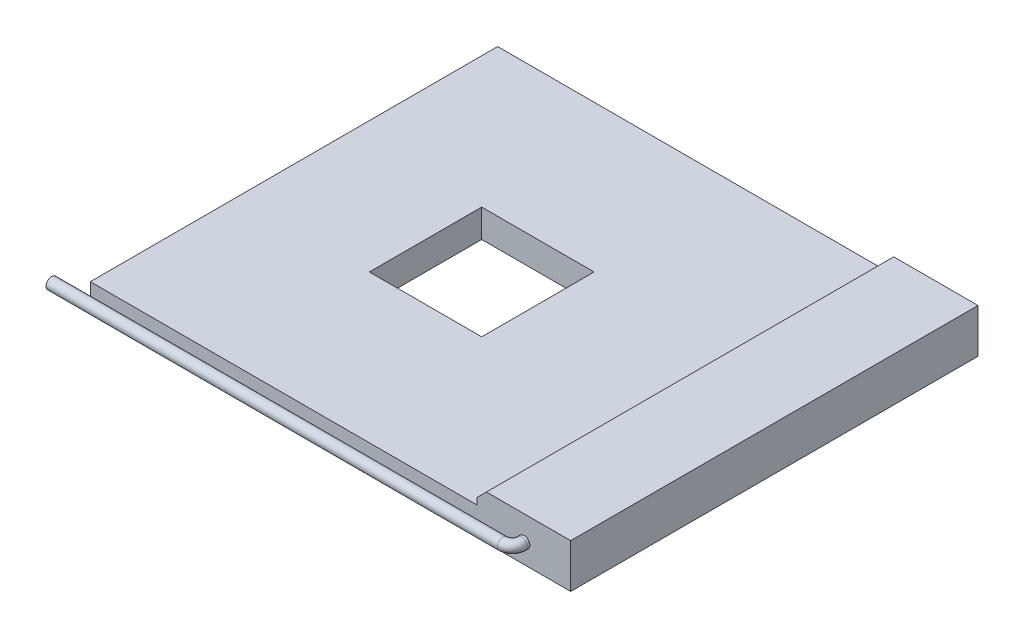
ISO-10303-21;
HEADER;
FILE_DESCRIPTION(('STEP AP214'),'2;1');
FILE_NAME('part.step','',(''),(''),'','','');
FILE_SCHEMA(('AUTOMOTIVE_DESIGN { 1 0 10303 214 1 1 1 1 }'));
ENDSEC;
DATA;
#1=APPLICATION_CONTEXT('core data for automotive mechanical design processes');
#2=APPLICATION_PROTOCOL_DEFINITION('international standard','automotive_design',2000,#1);
#3=PRODUCT_CONTEXT('',#1,'mechanical');
#4=PRODUCT('Part','Part','',(#3));
#5=PRODUCT_RELATED_PRODUCT_CATEGORY('part','',(#4));
#6=PRODUCT_DEFINITION_FORMATION('','',#4);
#7=PRODUCT_DEFINITION_CONTEXT('part definition',#1,'design');
#8=PRODUCT_DEFINITION('design','',#6,#7);
#9=PRODUCT_DEFINITION_SHAPE('','',#8);
#10=(LENGTH_UNIT() NAMED_UNIT(*) SI_UNIT(.MILLI.,.METRE.));
#11=(NAMED_UNIT(*) PLANE_ANGLE_UNIT() SI_UNIT($,.RADIAN.));
#12=(NAMED_UNIT(*) SI_UNIT($,.STERADIAN.) SOLID_ANGLE_UNIT());
#13=UNCERTAINTY_MEASURE_WITH_UNIT(LENGTH_MEASURE(1.E-05),#10,'distance_accuracy_value','');
#14=(GEOMETRIC_REPRESENTATION_CONTEXT(3) GLOBAL_UNCERTAINTY_ASSIGNED_CONTEXT((#13)) GLOBAL_UNIT_ASSIGNED_CONTEXT((#10,
#11,#12)) REPRESENTATION_CONTEXT('',''));
#15=CARTESIAN_POINT('',(0.,0.,0.));
#16=DIRECTION('',(0.,0.,1.));
#17=DIRECTION('',(1.,0.,0.));
#18=AXIS2_PLACEMENT_3D('',#15,#16,#17);
#19=CARTESIAN_POINT('',(0.,3.,0.));
#20=DIRECTION('',(0.,-1.,0.));
#21=DIRECTION('',(0.,0.,-1.));
#22=AXIS2_PLACEMENT_3D('',#19,#20,#21);
#23=PLANE('',#22);
#24=DIRECTION('',(1.,0.,0.));
#25=VECTOR('',#24,1.);
#26=CARTESIAN_POINT('',(-11.65,3.,5.95));
#27=LINE('',#26,#25);
#28=CARTESIAN_POINT('',(-11.65,3.,5.95));
#29=VERTEX_POINT('',#28);
#30=CARTESIAN_POINT('',(0.350000000000008,3.,5.95));
#31=VERTEX_POINT('',#30);
#32=EDGE_CURVE('E178',#29,#31,#27,.T.);
#33=ORIENTED_EDGE('',*,*,#32,.F.);
#34=DIRECTION('',(0.,0.,1.));
#35=VECTOR('',#34,1.);
#36=CARTESIAN_POINT('',(-11.65,3.,-6.05));
#37=LINE('',#36,#35);
#38=CARTESIAN_POINT('',(-11.65,3.,-6.05));
#39=VERTEX_POINT('',#38);
#40=EDGE_CURVE('E162',#39,#29,#37,.T.);
#41=ORIENTED_EDGE('',*,*,#40,.F.);
#42=DIRECTION('',(-1.,0.,0.));
#43=VECTOR('',#42,1.);
#44=CARTESIAN_POINT('',(-11.65,3.,-6.05));
#45=LINE('',#44,#43);
#46=CARTESIAN_POINT('',(0.350000000000007,3.,-6.05));
#47=VERTEX_POINT('',#46);
#48=EDGE_CURVE('E167',#47,#39,#45,.T.);
#49=ORIENTED_EDGE('',*,*,#48,.F.);
#50=DIRECTION('',(0.,0.,-1.));
#51=VECTOR('',#50,1.);
#52=CARTESIAN_POINT('',(0.350000000000007,3.,-6.05));
#53=LINE('',#52,#51);
#54=EDGE_CURVE('E181',#31,#47,#53,.T.);
#55=ORIENTED_EDGE('',*,*,#54,.F.);
#56=EDGE_LOOP('',(#33,#41,#49,#55));
#57=FACE_BOUND('',#56,.T.);
#58=DIRECTION('',(0.,0.,1.));
#59=VECTOR('',#58,1.);
#60=CARTESIAN_POINT('',(15.65,3.,-21.75));
#61=LINE('',#60,#59);
#62=CARTESIAN_POINT('',(15.65,3.,-21.75));
#63=VERTEX_POINT('',#62);
#64=CARTESIAN_POINT('',(15.65,3.,21.75));
#65=VERTEX_POINT('',#64);
#66=EDGE_CURVE('E149',#63,#65,#61,.T.);
#67=ORIENTED_EDGE('',*,*,#66,.F.);
#68=DIRECTION('',(-1.,0.,0.));
#69=VECTOR('',#68,1.);
#70=CARTESIAN_POINT('',(-25.65,3.,-21.75));
#71=LINE('',#70,#69);
#72=CARTESIAN_POINT('',(-25.65,3.,-21.75));
#73=VERTEX_POINT('',#72);
#74=EDGE_CURVE('E194',#63,#73,#71,.T.);
#75=ORIENTED_EDGE('',*,*,#74,.T.);
#76=DIRECTION('',(0.,0.,1.));
#77=VECTOR('',#76,1.);
#78=CARTESIAN_POINT('',(-25.65,3.,21.75));
#79=LINE('',#78,#77);
#80=CARTESIAN_POINT('',(-25.65,3.,21.75));
#81=VERTEX_POINT('',#80);
#82=EDGE_CURVE('E196',#73,#81,#79,.T.);
#83=ORIENTED_EDGE('',*,*,#82,.T.);
#84=DIRECTION('',(1.,0.,0.));
#85=VECTOR('',#84,1.);
#86=CARTESIAN_POINT('',(-25.65,3.,21.75));
#87=LINE('',#86,#85);
#88=EDGE_CURVE('E199',#81,#65,#87,.T.);
#89=ORIENTED_EDGE('',*,*,#88,.T.);
#90=EDGE_LOOP('',(#67,#75,#83,#89));
#91=FACE_BOUND('',#90,.T.);
#92=ADVANCED_FACE('F40',(#57,#91),#23,.F.);
#93=CARTESIAN_POINT('',(25.65,3.,21.75));
#94=DIRECTION('',(-1.,0.,0.));
#95=DIRECTION('',(0.,0.,1.));
#96=AXIS2_PLACEMENT_3D('',#93,#94,#95);
#97=PLANE('',#96);
#98=DIRECTION('',(0.,0.,-1.));
#99=VECTOR('',#98,1.);
#100=CARTESIAN_POINT('',(25.65,0.,21.75));
#101=LINE('',#100,#99);
#102=CARTESIAN_POINT('',(25.65,0.,21.75));
#103=VERTEX_POINT('',#102);
#104=CARTESIAN_POINT('',(25.65,0.,-21.75));
#105=VERTEX_POINT('',#104);
#106=EDGE_CURVE('E133',#103,#105,#101,.T.);
#107=ORIENTED_EDGE('',*,*,#106,.T.);
#108=DIRECTION('',(0.,-1.,0.));
#109=VECTOR('',#108,1.);
#110=CARTESIAN_POINT('',(25.65,3.,-21.75));
#111=LINE('',#110,#109);
#112=CARTESIAN_POINT('',(25.65,4.7,-21.75));
#113=VERTEX_POINT('',#112);
#114=EDGE_CURVE('E126',#113,#105,#111,.T.);
#115=ORIENTED_EDGE('',*,*,#114,.F.);
#116=DIRECTION('',(0.,0.,-1.));
#117=VECTOR('',#116,1.);
#118=CARTESIAN_POINT('',(25.65,4.7,-21.75));
#119=LINE('',#118,#117);
#120=CARTESIAN_POINT('',(25.65,4.7,21.75));
#121=VERTEX_POINT('',#120);
#122=EDGE_CURVE('E131',#121,#113,#119,.T.);
#123=ORIENTED_EDGE('',*,*,#122,.F.);
#124=DIRECTION('',(0.,-1.,0.));
#125=VECTOR('',#124,1.);
#126=CARTESIAN_POINT('',(25.65,3.,21.75));
#127=LINE('',#126,#125);
#128=EDGE_CURVE('E203',#121,#103,#127,.T.);
#129=ORIENTED_EDGE('',*,*,#128,.T.);
#130=EDGE_LOOP('',(#107,#115,#123,#129));
#131=FACE_BOUND('',#130,.T.);
#132=ADVANCED_FACE('F128',(#131),#97,.F.);
#133=CARTESIAN_POINT('',(-25.65,3.,-21.75));
#134=DIRECTION('',(0.,0.,1.));
#135=DIRECTION('',(1.,0.,0.));
#136=AXIS2_PLACEMENT_3D('',#133,#134,#135);
#137=PLANE('',#136);
#138=DIRECTION('',(0.,-1.,0.));
#139=VECTOR('',#138,1.);
#140=CARTESIAN_POINT('',(15.65,4.7,-21.75));
#141=LINE('',#140,#139);
#142=CARTESIAN_POINT('',(15.65,3.7,-21.75));
#143=VERTEX_POINT('',#142);
#144=EDGE_CURVE('E160',#143,#63,#141,.T.);
#145=ORIENTED_EDGE('',*,*,#144,.F.);
#146=DIRECTION('',(-0.707106781186548,-0.707106781186547,0.));
#147=VECTOR('',#146,1.);
#148=CARTESIAN_POINT('',(16.65,4.7,-21.75));
#149=LINE('',#148,#147);
#150=CARTESIAN_POINT('',(16.65,4.7,-21.75));
#151=VERTEX_POINT('',#150);
#152=EDGE_CURVE('E45',#143,#151,#149,.F.);
#153=ORIENTED_EDGE('',*,*,#152,.T.);
#154=DIRECTION('',(-1.,0.,0.));
#155=VECTOR('',#154,1.);
#156=CARTESIAN_POINT('',(25.65,4.7,-21.75));
#157=LINE('',#156,#155);
#158=EDGE_CURVE('E139',#113,#151,#157,.T.);
#159=ORIENTED_EDGE('',*,*,#158,.F.);
#160=ORIENTED_EDGE('',*,*,#114,.T.);
#161=DIRECTION('',(-1.,0.,0.));
#162=VECTOR('',#161,1.);
#163=CARTESIAN_POINT('',(-25.65,0.,-21.75));
#164=LINE('',#163,#162);
#165=CARTESIAN_POINT('',(-25.65,0.,-21.75));
#166=VERTEX_POINT('',#165);
#167=EDGE_CURVE('E205',#105,#166,#164,.T.);
#168=ORIENTED_EDGE('',*,*,#167,.T.);
#169=DIRECTION('',(0.,-1.,0.));
#170=VECTOR('',#169,1.);
#171=CARTESIAN_POINT('',(-25.65,3.,-21.75));
#172=LINE('',#171,#170);
#173=EDGE_CURVE('E136',#73,#166,#172,.T.);
#174=ORIENTED_EDGE('',*,*,#173,.F.);
#175=ORIENTED_EDGE('',*,*,#74,.F.);
#176=EDGE_LOOP('',(#145,#153,#159,#160,#168,#174,#175));
#177=FACE_BOUND('',#176,.T.);
#178=ADVANCED_FACE('F140',(#177),#137,.F.);
#179=CARTESIAN_POINT('',(-25.65,3.,21.75));
#180=DIRECTION('',(1.,0.,0.));
#181=DIRECTION('',(0.,0.,-1.));
#182=AXIS2_PLACEMENT_3D('',#179,#180,#181);
#183=PLANE('',#182);
#184=DIRECTION('',(0.,0.,1.));
#185=VECTOR('',#184,1.);
#186=CARTESIAN_POINT('',(-25.65,0.,21.75));
#187=LINE('',#186,#185);
#188=CARTESIAN_POINT('',(-25.65,0.,21.75));
#189=VERTEX_POINT('',#188);
#190=EDGE_CURVE('E207',#166,#189,#187,.T.);
#191=ORIENTED_EDGE('',*,*,#190,.T.);
#192=DIRECTION('',(0.,-1.,0.));
#193=VECTOR('',#192,1.);
#194=CARTESIAN_POINT('',(-25.65,3.,21.75));
#195=LINE('',#194,#193);
#196=EDGE_CURVE('E212',#81,#189,#195,.T.);
#197=ORIENTED_EDGE('',*,*,#196,.F.);
#198=ORIENTED_EDGE('',*,*,#82,.F.);
#199=ORIENTED_EDGE('',*,*,#173,.T.);
#200=EDGE_LOOP('',(#191,#197,#198,#199));
#201=FACE_BOUND('',#200,.T.);
#202=ADVANCED_FACE('F228',(#201),#183,.F.);
#203=CARTESIAN_POINT('',(-25.65,3.,21.75));
#204=DIRECTION('',(0.,0.,-1.));
#205=DIRECTION('',(-1.,0.,0.));
#206=AXIS2_PLACEMENT_3D('',#203,#204,#205);
#207=PLANE('',#206);
#208=CARTESIAN_POINT('',(20.686540359983,2.09489692381202,21.75));
#209=DIRECTION('',(0.,0.,1.));
#210=DIRECTION('',(1.,0.,0.));
#211=AXIS2_PLACEMENT_3D('',#208,#209,#210);
#212=CIRCLE('',#211,0.6);
#213=CARTESIAN_POINT('',(21.286540359983,2.09489692381202,21.75));
#214=VERTEX_POINT('',#213);
#215=EDGE_CURVE('E11',#214,#214,#212,.T.);
#216=ORIENTED_EDGE('',*,*,#215,.F.);
#217=EDGE_LOOP('',(#216));
#218=FACE_BOUND('',#217,.T.);
#219=DIRECTION('',(1.,0.,0.));
#220=VECTOR('',#219,1.);
#221=CARTESIAN_POINT('',(25.65,4.7,21.75));
#222=LINE('',#221,#220);
#223=CARTESIAN_POINT('',(16.65,4.7,21.75));
#224=VERTEX_POINT('',#223);
#225=EDGE_CURVE('E145',#224,#121,#222,.T.);
#226=ORIENTED_EDGE('',*,*,#225,.F.);
#227=DIRECTION('',(0.707106781186548,0.707106781186547,0.));
#228=VECTOR('',#227,1.);
#229=CARTESIAN_POINT('',(16.65,4.7,21.75));
#230=LINE('',#229,#228);
#231=CARTESIAN_POINT('',(15.65,3.7,21.75));
#232=VERTEX_POINT('',#231);
#233=EDGE_CURVE('E65',#224,#232,#230,.F.);
#234=ORIENTED_EDGE('',*,*,#233,.T.);
#235=DIRECTION('',(0.,-1.,0.));
#236=VECTOR('',#235,1.);
#237=CARTESIAN_POINT('',(15.65,4.7,21.75));
#238=LINE('',#237,#236);
#239=EDGE_CURVE('E157',#232,#65,#238,.T.);
#240=ORIENTED_EDGE('',*,*,#239,.T.);
#241=ORIENTED_EDGE('',*,*,#88,.F.);
#242=ORIENTED_EDGE('',*,*,#196,.T.);
#243=DIRECTION('',(1.,0.,0.));
#244=VECTOR('',#243,1.);
#245=CARTESIAN_POINT('',(-25.65,0.,21.75));
#246=LINE('',#245,#244);
#247=EDGE_CURVE('E197',#189,#103,#246,.T.);
#248=ORIENTED_EDGE('',*,*,#247,.T.);
#249=ORIENTED_EDGE('',*,*,#128,.F.);
#250=EDGE_LOOP('',(#226,#234,#240,#241,#242,#248,#249));
#251=FACE_BOUND('',#250,.T.);
#252=ADVANCED_FACE('F219',(#218,#251),#207,.F.);
#253=CARTESIAN_POINT('',(0.,0.,0.));
#254=DIRECTION('',(0.,-1.,0.));
#255=DIRECTION('',(0.,0.,-1.));
#256=AXIS2_PLACEMENT_3D('',#253,#254,#255);
#257=PLANE('',#256);
#258=DIRECTION('',(0.,0.,1.));
#259=VECTOR('',#258,1.);
#260=CARTESIAN_POINT('',(-11.65,0.,-6.05));
#261=LINE('',#260,#259);
#262=CARTESIAN_POINT('',(-11.65,0.,-6.05));
#263=VERTEX_POINT('',#262);
#264=CARTESIAN_POINT('',(-11.65,0.,5.95));
#265=VERTEX_POINT('',#264);
#266=EDGE_CURVE('E163',#263,#265,#261,.T.);
#267=ORIENTED_EDGE('',*,*,#266,.T.);
#268=DIRECTION('',(1.,0.,0.));
#269=VECTOR('',#268,1.);
#270=CARTESIAN_POINT('',(-11.65,0.,5.95));
#271=LINE('',#270,#269);
#272=CARTESIAN_POINT('',(0.350000000000008,0.,5.95));
#273=VERTEX_POINT('',#272);
#274=EDGE_CURVE('E166',#265,#273,#271,.T.);
#275=ORIENTED_EDGE('',*,*,#274,.T.);
#276=DIRECTION('',(0.,0.,-1.));
#277=VECTOR('',#276,1.);
#278=CARTESIAN_POINT('',(0.350000000000007,0.,-6.05));
#279=LINE('',#278,#277);
#280=CARTESIAN_POINT('',(0.350000000000007,0.,-6.05));
#281=VERTEX_POINT('',#280);
#282=EDGE_CURVE('E170',#273,#281,#279,.T.);
#283=ORIENTED_EDGE('',*,*,#282,.T.);
#284=DIRECTION('',(-1.,0.,0.));
#285=VECTOR('',#284,1.);
#286=CARTESIAN_POINT('',(-11.65,0.,-6.05));
#287=LINE('',#286,#285);
#288=EDGE_CURVE('E173',#281,#263,#287,.T.);
#289=ORIENTED_EDGE('',*,*,#288,.T.);
#290=EDGE_LOOP('',(#267,#275,#283,#289));
#291=FACE_BOUND('',#290,.T.);
#292=ORIENTED_EDGE('',*,*,#106,.F.);
#293=ORIENTED_EDGE('',*,*,#247,.F.);
#294=ORIENTED_EDGE('',*,*,#190,.F.);
#295=ORIENTED_EDGE('',*,*,#167,.F.);
#296=EDGE_LOOP('',(#292,#293,#294,#295));
#297=FACE_BOUND('',#296,.T.);
#298=ADVANCED_FACE('F222',(#291,#297),#257,.T.);
#299=CARTESIAN_POINT('',(-11.65,0.,-6.05));
#300=DIRECTION('',(-1.,0.,0.));
#301=DIRECTION('',(0.,0.,1.));
#302=AXIS2_PLACEMENT_3D('',#299,#300,#301);
#303=PLANE('',#302);
#304=ORIENTED_EDGE('',*,*,#40,.T.);
#305=DIRECTION('',(0.,1.,0.));
#306=VECTOR('',#305,1.);
#307=CARTESIAN_POINT('',(-11.65,0.,5.95));
#308=LINE('',#307,#306);
#309=EDGE_CURVE('E176',#265,#29,#308,.T.);
#310=ORIENTED_EDGE('',*,*,#309,.F.);
#311=ORIENTED_EDGE('',*,*,#266,.F.);
#312=DIRECTION('',(0.,1.,0.));
#313=VECTOR('',#312,1.);
#314=CARTESIAN_POINT('',(-11.65,0.,-6.05));
#315=LINE('',#314,#313);
#316=EDGE_CURVE('E186',#263,#39,#315,.T.);
#317=ORIENTED_EDGE('',*,*,#316,.T.);
#318=EDGE_LOOP('',(#304,#310,#311,#317));
#319=FACE_BOUND('',#318,.T.);
#320=ADVANCED_FACE('F258',(#319),#303,.F.);
#321=CARTESIAN_POINT('',(-11.65,0.,-6.05));
#322=DIRECTION('',(0.,0.,-1.));
#323=DIRECTION('',(-1.,0.,0.));
#324=AXIS2_PLACEMENT_3D('',#321,#322,#323);
#325=PLANE('',#324);
#326=ORIENTED_EDGE('',*,*,#48,.T.);
#327=ORIENTED_EDGE('',*,*,#316,.F.);
#328=ORIENTED_EDGE('',*,*,#288,.F.);
#329=DIRECTION('',(0.,1.,0.));
#330=VECTOR('',#329,1.);
#331=CARTESIAN_POINT('',(0.350000000000007,0.,-6.05));
#332=LINE('',#331,#330);
#333=EDGE_CURVE('E188',#281,#47,#332,.T.);
#334=ORIENTED_EDGE('',*,*,#333,.T.);
#335=EDGE_LOOP('',(#326,#327,#328,#334));
#336=FACE_BOUND('',#335,.T.);
#337=ADVANCED_FACE('F294',(#336),#325,.F.);
#338=CARTESIAN_POINT('',(0.350000000000007,0.,-6.05));
#339=DIRECTION('',(1.,0.,0.));
#340=DIRECTION('',(0.,0.,-1.));
#341=AXIS2_PLACEMENT_3D('',#338,#339,#340);
#342=PLANE('',#341);
#343=ORIENTED_EDGE('',*,*,#54,.T.);
#344=ORIENTED_EDGE('',*,*,#333,.F.);
#345=ORIENTED_EDGE('',*,*,#282,.F.);
#346=DIRECTION('',(0.,1.,0.));
#347=VECTOR('',#346,1.);
#348=CARTESIAN_POINT('',(0.350000000000008,0.,5.95));
#349=LINE('',#348,#347);
#350=EDGE_CURVE('E190',#273,#31,#349,.T.);
#351=ORIENTED_EDGE('',*,*,#350,.T.);
#352=EDGE_LOOP('',(#343,#344,#345,#351));
#353=FACE_BOUND('',#352,.T.);
#354=ADVANCED_FACE('F301',(#353),#342,.F.);
#355=CARTESIAN_POINT('',(-11.65,0.,5.95));
#356=DIRECTION('',(0.,0.,1.));
#357=DIRECTION('',(1.,0.,0.));
#358=AXIS2_PLACEMENT_3D('',#355,#356,#357);
#359=PLANE('',#358);
#360=ORIENTED_EDGE('',*,*,#32,.T.);
#361=ORIENTED_EDGE('',*,*,#350,.F.);
#362=ORIENTED_EDGE('',*,*,#274,.F.);
#363=ORIENTED_EDGE('',*,*,#309,.T.);
#364=EDGE_LOOP('',(#360,#361,#362,#363));
#365=FACE_BOUND('',#364,.T.);
#366=ADVANCED_FACE('F309',(#365),#359,.F.);
#367=CARTESIAN_POINT('',(15.65,4.7,-21.75));
#368=DIRECTION('',(1.,0.,0.));
#369=DIRECTION('',(0.,0.,-1.));
#370=AXIS2_PLACEMENT_3D('',#367,#368,#369);
#371=PLANE('',#370);
#372=ORIENTED_EDGE('',*,*,#239,.F.);
#373=DIRECTION('',(0.,0.,-1.));
#374=VECTOR('',#373,1.);
#375=CARTESIAN_POINT('',(15.65,3.7,-21.75));
#376=LINE('',#375,#374);
#377=EDGE_CURVE('E57',#232,#143,#376,.T.);
#378=ORIENTED_EDGE('',*,*,#377,.T.);
#379=ORIENTED_EDGE('',*,*,#144,.T.);
#380=ORIENTED_EDGE('',*,*,#66,.T.);
#381=EDGE_LOOP('',(#372,#378,#379,#380));
#382=FACE_BOUND('',#381,.T.);
#383=ADVANCED_FACE('F243',(#382),#371,.F.);
#384=CARTESIAN_POINT('',(0.,4.7,0.));
#385=DIRECTION('',(0.,-1.,0.));
#386=DIRECTION('',(0.,0.,-1.));
#387=AXIS2_PLACEMENT_3D('',#384,#385,#386);
#388=PLANE('',#387);
#389=ORIENTED_EDGE('',*,*,#158,.T.);
#390=DIRECTION('',(0.,0.,1.));
#391=VECTOR('',#390,1.);
#392=CARTESIAN_POINT('',(16.65,4.7,0.));
#393=LINE('',#392,#391);
#394=EDGE_CURVE('E135',#151,#224,#393,.T.);
#395=ORIENTED_EDGE('',*,*,#394,.T.);
#396=ORIENTED_EDGE('',*,*,#225,.T.);
#397=ORIENTED_EDGE('',*,*,#122,.T.);
#398=EDGE_LOOP('',(#389,#395,#396,#397));
#399=FACE_BOUND('',#398,.T.);
#400=ADVANCED_FACE('F147',(#399),#388,.F.);
#401=CARTESIAN_POINT('',(16.65,4.7,0.));
#402=DIRECTION('',(0.707106781186547,-0.707106781186548,0.));
#403=DIRECTION('',(0.,0.,1.));
#404=AXIS2_PLACEMENT_3D('',#401,#402,#403);
#405=PLANE('',#404);
#406=ORIENTED_EDGE('',*,*,#152,.F.);
#407=ORIENTED_EDGE('',*,*,#377,.F.);
#408=ORIENTED_EDGE('',*,*,#233,.F.);
#409=ORIENTED_EDGE('',*,*,#394,.F.);
#410=EDGE_LOOP('',(#406,#407,#408,#409));
#411=FACE_BOUND('',#410,.T.);
#412=ADVANCED_FACE('F43',(#411),#405,.F.);
#413=CARTESIAN_POINT('',(-28.5027448042328,2.09489692381202,23.0312357569917));
#414=DIRECTION('',(-1.,0.,0.));
#415=DIRECTION('',(0.,0.,1.));
#416=AXIS2_PLACEMENT_3D('',#413,#414,#415);
#417=PLANE('',#416);
#418=CARTESIAN_POINT('',(-28.5027448042328,2.09489692381202,23.0312357569917));
#419=DIRECTION('',(-1.,0.,0.));
#420=DIRECTION('',(0.,0.,1.));
#421=AXIS2_PLACEMENT_3D('',#418,#419,#420);
#422=CIRCLE('',#421,0.6);
#423=CARTESIAN_POINT('',(-28.5027448042328,2.09489692381202,23.6312357569917));
#424=VERTEX_POINT('',#423);
#425=EDGE_CURVE('E152',#424,#424,#422,.T.);
#426=ORIENTED_EDGE('',*,*,#425,.T.);
#427=EDGE_LOOP('',(#426));
#428=FACE_BOUND('',#427,.T.);
#429=ADVANCED_FACE('F234',(#428),#417,.T.);
#430=CARTESIAN_POINT('',(20.686540359983,2.09489692381202,21.75));
#431=DIRECTION('',(0.,0.,1.));
#432=DIRECTION('',(1.,0.,0.));
#433=AXIS2_PLACEMENT_3D('',#430,#431,#432);
#434=CYLINDRICAL_SURFACE('',#433,0.6);
#435=CARTESIAN_POINT('',(20.686540359983,2.09489692381202,22.0312357569917));
#436=DIRECTION('',(0.,0.,1.));
#437=DIRECTION('',(1.,0.,0.));
#438=AXIS2_PLACEMENT_3D('',#435,#436,#437);
#439=CIRCLE('',#438,0.6);
#440=CARTESIAN_POINT('',(21.2865403599828,2.09489692381202,22.0312357569917));
#441=VERTEX_POINT('',#440);
#442=EDGE_CURVE('E375',#441,#441,#439,.T.);
#443=ORIENTED_EDGE('',*,*,#442,.F.);
#444=EDGE_LOOP('',(#443));
#445=FACE_BOUND('',#444,.T.);
#446=ORIENTED_EDGE('',*,*,#215,.T.);
#447=EDGE_LOOP('',(#446));
#448=FACE_BOUND('',#447,.T.);
#449=ADVANCED_FACE('F240',(#445,#448),#434,.T.);
#450=CARTESIAN_POINT('',(19.686540359983,2.09489692381202,22.0312357569917));
#451=DIRECTION('',(0.,-1.,0.));
#452=DIRECTION('',(0.,0.,-1.));
#453=AXIS2_PLACEMENT_3D('',#450,#451,#452);
#454=TOROIDAL_SURFACE('',#453,0.999999999999852,0.6);
#455=CARTESIAN_POINT('',(19.686540359983,2.09489692381202,23.0312357569917));
#456=DIRECTION('',(-1.,0.,0.));
#457=DIRECTION('',(0.,0.,1.));
#458=AXIS2_PLACEMENT_3D('',#455,#456,#457);
#459=CIRCLE('',#458,0.6);
#460=CARTESIAN_POINT('',(19.686540359983,2.09489692381202,23.6312357569916));
#461=VERTEX_POINT('',#460);
#462=EDGE_CURVE('E372',#461,#461,#459,.T.);
#463=CARTESIAN_POINT('',(19.686540359983,2.09489692381202,22.0312357569917));
#464=DIRECTION('',(0.,-1.,0.));
#465=DIRECTION('',(0.,0.,-1.));
#466=AXIS2_PLACEMENT_3D('',#463,#464,#465);
#467=CIRCLE('',#466,1.59999999999985);
#468=EDGE_CURVE('',#441,#461,#467,.T.);
#469=ORIENTED_EDGE('',*,*,#442,.T.);
#470=ORIENTED_EDGE('',*,*,#462,.F.);
#471=ORIENTED_EDGE('',*,*,#468,.T.);
#472=ORIENTED_EDGE('',*,*,#468,.F.);
#473=EDGE_LOOP('',(#469,#471,#470,#472));
#474=FACE_BOUND('',#473,.T.);
#475=ADVANCED_FACE('F246',(#474),#454,.T.);
#476=CARTESIAN_POINT('',(19.686540359983,2.09489692381202,23.0312357569917));
#477=DIRECTION('',(-1.,0.,0.));
#478=DIRECTION('',(0.,0.,1.));
#479=AXIS2_PLACEMENT_3D('',#476,#477,#478);
#480=CYLINDRICAL_SURFACE('',#479,0.6);
#481=ORIENTED_EDGE('',*,*,#425,.F.);
#482=EDGE_LOOP('',(#481));
#483=FACE_BOUND('',#482,.T.);
#484=ORIENTED_EDGE('',*,*,#462,.T.);
#485=EDGE_LOOP('',(#484));
#486=FACE_BOUND('',#485,.T.);
#487=ADVANCED_FACE('F235',(#483,#486),#480,.T.);
#488=CLOSED_SHELL('',(#92,#132,#178,#202,#252,#298,#320,#337,#354,#366,#383,#400,#412,#429,#449,
#475,#487));
#489=MANIFOLD_SOLID_BREP('B2',#488);
#490=ADVANCED_BREP_SHAPE_REPRESENTATION('',(#18,#489),#14);
#491=SHAPE_DEFINITION_REPRESENTATION(#9,#490);
ENDSEC;
END-ISO-10303-21;
